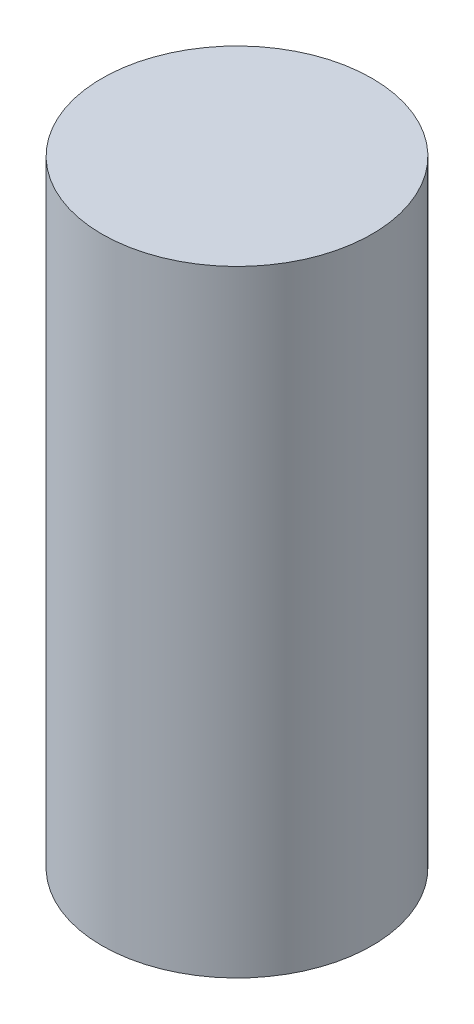
ISO-10303-21;
HEADER;
FILE_DESCRIPTION(('STEP AP214'),'2;1');
FILE_NAME('part.step','',(''),(''),'','','');
FILE_SCHEMA(('AUTOMOTIVE_DESIGN { 1 0 10303 214 1 1 1 1 }'));
ENDSEC;
DATA;
#1=APPLICATION_CONTEXT('core data for automotive mechanical design processes');
#2=APPLICATION_PROTOCOL_DEFINITION('international standard','automotive_design',2000,#1);
#3=PRODUCT_CONTEXT('',#1,'mechanical');
#4=PRODUCT('Part','Part','',(#3));
#5=PRODUCT_RELATED_PRODUCT_CATEGORY('part','',(#4));
#6=PRODUCT_DEFINITION_FORMATION('','',#4);
#7=PRODUCT_DEFINITION_CONTEXT('part definition',#1,'design');
#8=PRODUCT_DEFINITION('design','',#6,#7);
#9=PRODUCT_DEFINITION_SHAPE('','',#8);
#10=(LENGTH_UNIT() NAMED_UNIT(*) SI_UNIT(.MILLI.,.METRE.));
#11=(NAMED_UNIT(*) PLANE_ANGLE_UNIT() SI_UNIT($,.RADIAN.));
#12=(NAMED_UNIT(*) SI_UNIT($,.STERADIAN.) SOLID_ANGLE_UNIT());
#13=UNCERTAINTY_MEASURE_WITH_UNIT(LENGTH_MEASURE(1.E-05),#10,'distance_accuracy_value','');
#14=(GEOMETRIC_REPRESENTATION_CONTEXT(3) GLOBAL_UNCERTAINTY_ASSIGNED_CONTEXT((#13)) GLOBAL_UNIT_ASSIGNED_CONTEXT((#10,
#11,#12)) REPRESENTATION_CONTEXT('',''));
#15=CARTESIAN_POINT('',(0.,0.,0.));
#16=DIRECTION('',(0.,0.,1.));
#17=DIRECTION('',(1.,0.,0.));
#18=AXIS2_PLACEMENT_3D('',#15,#16,#17);
#19=CARTESIAN_POINT('',(0.,62.,0.));
#20=DIRECTION('',(0.,-1.,0.));
#21=DIRECTION('',(0.,0.,-1.));
#22=AXIS2_PLACEMENT_3D('',#19,#20,#21);
#23=CYLINDRICAL_SURFACE('',#22,13.585);
#24=CARTESIAN_POINT('',(0.,62.,0.));
#25=DIRECTION('',(0.,1.,0.));
#26=DIRECTION('',(0.,0.,1.));
#27=AXIS2_PLACEMENT_3D('',#24,#25,#26);
#28=CIRCLE('',#27,13.585);
#29=CARTESIAN_POINT('',(0.,62.,13.585));
#30=VERTEX_POINT('',#29);
#31=EDGE_CURVE('E53',#30,#30,#28,.T.);
#32=ORIENTED_EDGE('',*,*,#31,.F.);
#33=EDGE_LOOP('',(#32));
#34=FACE_BOUND('',#33,.T.);
#35=CARTESIAN_POINT('',(0.,0.,0.));
#36=DIRECTION('',(0.,1.,0.));
#37=DIRECTION('',(0.,0.,1.));
#38=AXIS2_PLACEMENT_3D('',#35,#36,#37);
#39=CIRCLE('',#38,13.585);
#40=CARTESIAN_POINT('',(0.,0.,13.585));
#41=VERTEX_POINT('',#40);
#42=EDGE_CURVE('E58',#41,#41,#39,.T.);
#43=ORIENTED_EDGE('',*,*,#42,.T.);
#44=EDGE_LOOP('',(#43));
#45=FACE_BOUND('',#44,.T.);
#46=ADVANCED_FACE('F41',(#34,#45),#23,.T.);
#47=CARTESIAN_POINT('',(0.,62.,0.));
#48=DIRECTION('',(0.,1.,0.));
#49=DIRECTION('',(0.,0.,1.));
#50=AXIS2_PLACEMENT_3D('',#47,#48,#49);
#51=PLANE('',#50);
#52=ORIENTED_EDGE('',*,*,#31,.T.);
#53=EDGE_LOOP('',(#52));
#54=FACE_BOUND('',#53,.T.);
#55=ADVANCED_FACE('F103',(#54),#51,.T.);
#56=CARTESIAN_POINT('',(0.,0.,0.));
#57=DIRECTION('',(0.,1.,0.));
#58=DIRECTION('',(0.,0.,1.));
#59=AXIS2_PLACEMENT_3D('',#56,#57,#58);
#60=PLANE('',#59);
#61=CARTESIAN_POINT('',(0.,0.,0.));
#62=DIRECTION('',(0.,1.,0.));
#63=DIRECTION('',(0.,0.,1.));
#64=AXIS2_PLACEMENT_3D('',#61,#62,#63);
#65=CIRCLE('',#64,3.33901321520406);
#66=CARTESIAN_POINT('',(0.,0.,3.33901321520406));
#67=VERTEX_POINT('',#66);
#68=EDGE_CURVE('E48',#67,#67,#65,.F.);
#69=ORIENTED_EDGE('',*,*,#68,.F.);
#70=EDGE_LOOP('',(#69));
#71=FACE_BOUND('',#70,.T.);
#72=ORIENTED_EDGE('',*,*,#42,.F.);
#73=EDGE_LOOP('',(#72));
#74=FACE_BOUND('',#73,.T.);
#75=ADVANCED_FACE('F94',(#71,#74),#60,.F.);
#76=CARTESIAN_POINT('',(0.,0.,0.));
#77=DIRECTION('',(0.,1.,0.));
#78=DIRECTION('',(0.,0.,1.));
#79=AXIS2_PLACEMENT_3D('',#76,#77,#78);
#80=CYLINDRICAL_SURFACE('',#79,2.33901321520406);
#81=CARTESIAN_POINT('',(0.,-6.,0.));
#82=DIRECTION('',(0.,1.,0.));
#83=DIRECTION('',(0.,0.,1.));
#84=AXIS2_PLACEMENT_3D('',#81,#82,#83);
#85=CIRCLE('',#84,2.33901321520406);
#86=CARTESIAN_POINT('',(0.,-6.,2.33901321520406));
#87=VERTEX_POINT('',#86);
#88=EDGE_CURVE('E84',#87,#87,#85,.T.);
#89=ORIENTED_EDGE('',*,*,#88,.F.);
#90=EDGE_LOOP('',(#89));
#91=FACE_BOUND('',#90,.T.);
#92=CARTESIAN_POINT('',(0.,0.,0.));
#93=DIRECTION('',(0.,1.,0.));
#94=DIRECTION('',(0.,0.,1.));
#95=AXIS2_PLACEMENT_3D('',#92,#93,#94);
#96=CIRCLE('',#95,2.33901321520406);
#97=CARTESIAN_POINT('',(0.,0.,2.33901321520406));
#98=VERTEX_POINT('',#97);
#99=EDGE_CURVE('E10',#98,#98,#96,.T.);
#100=ORIENTED_EDGE('',*,*,#99,.T.);
#101=EDGE_LOOP('',(#100));
#102=FACE_BOUND('',#101,.T.);
#103=ADVANCED_FACE('F91',(#91,#102),#80,.F.);
#104=CARTESIAN_POINT('',(0.,-2.,0.));
#105=DIRECTION('',(0.,1.,0.));
#106=DIRECTION('',(0.,0.,1.));
#107=AXIS2_PLACEMENT_3D('',#104,#105,#106);
#108=CONICAL_SURFACE('',#107,2.73901321520406,0.291456794477867);
#109=ORIENTED_EDGE('',*,*,#68,.T.);
#110=EDGE_LOOP('',(#109));
#111=FACE_BOUND('',#110,.T.);
#112=CARTESIAN_POINT('',(0.,-2.,0.));
#113=DIRECTION('',(0.,1.,0.));
#114=DIRECTION('',(0.,0.,1.));
#115=AXIS2_PLACEMENT_3D('',#112,#113,#114);
#116=CIRCLE('',#115,2.73901321520406);
#117=CARTESIAN_POINT('',(0.,-2.,2.73901321520406));
#118=VERTEX_POINT('',#117);
#119=EDGE_CURVE('E63',#118,#118,#116,.T.);
#120=ORIENTED_EDGE('',*,*,#119,.T.);
#121=EDGE_LOOP('',(#120));
#122=FACE_BOUND('',#121,.T.);
#123=ADVANCED_FACE('F93',(#111,#122),#108,.T.);
#124=CARTESIAN_POINT('',(2.73901321520406,-2.,0.));
#125=DIRECTION('',(0.,-1.,0.));
#126=DIRECTION('',(0.,0.,-1.));
#127=AXIS2_PLACEMENT_3D('',#124,#125,#126);
#128=PLANE('',#127);
#129=ORIENTED_EDGE('',*,*,#119,.F.);
#130=EDGE_LOOP('',(#129));
#131=FACE_BOUND('',#130,.T.);
#132=CARTESIAN_POINT('',(0.,-2.,0.));
#133=DIRECTION('',(0.,1.,0.));
#134=DIRECTION('',(0.,0.,1.));
#135=AXIS2_PLACEMENT_3D('',#132,#133,#134);
#136=CIRCLE('',#135,3.33901321520406);
#137=CARTESIAN_POINT('',(0.,-2.,3.33901321520406));
#138=VERTEX_POINT('',#137);
#139=EDGE_CURVE('E68',#138,#138,#136,.T.);
#140=ORIENTED_EDGE('',*,*,#139,.T.);
#141=EDGE_LOOP('',(#140));
#142=FACE_BOUND('',#141,.T.);
#143=ADVANCED_FACE('F100',(#131,#142),#128,.F.);
#144=CARTESIAN_POINT('',(0.,-4.,0.));
#145=DIRECTION('',(0.,1.,0.));
#146=DIRECTION('',(0.,0.,1.));
#147=AXIS2_PLACEMENT_3D('',#144,#145,#146);
#148=CONICAL_SURFACE('',#147,2.73901321520406,0.291456794477867);
#149=ORIENTED_EDGE('',*,*,#139,.F.);
#150=EDGE_LOOP('',(#149));
#151=FACE_BOUND('',#150,.T.);
#152=CARTESIAN_POINT('',(0.,-4.,0.));
#153=DIRECTION('',(0.,1.,0.));
#154=DIRECTION('',(0.,0.,1.));
#155=AXIS2_PLACEMENT_3D('',#152,#153,#154);
#156=CIRCLE('',#155,2.73901321520406);
#157=CARTESIAN_POINT('',(0.,-4.,2.73901321520406));
#158=VERTEX_POINT('',#157);
#159=EDGE_CURVE('E72',#158,#158,#156,.T.);
#160=ORIENTED_EDGE('',*,*,#159,.T.);
#161=EDGE_LOOP('',(#160));
#162=FACE_BOUND('',#161,.T.);
#163=ADVANCED_FACE('F156',(#151,#162),#148,.T.);
#164=CARTESIAN_POINT('',(2.73901321520406,-4.,0.));
#165=DIRECTION('',(0.,-1.,0.));
#166=DIRECTION('',(0.,0.,-1.));
#167=AXIS2_PLACEMENT_3D('',#164,#165,#166);
#168=PLANE('',#167);
#169=ORIENTED_EDGE('',*,*,#159,.F.);
#170=EDGE_LOOP('',(#169));
#171=FACE_BOUND('',#170,.T.);
#172=CARTESIAN_POINT('',(0.,-4.,0.));
#173=DIRECTION('',(0.,1.,0.));
#174=DIRECTION('',(0.,0.,1.));
#175=AXIS2_PLACEMENT_3D('',#172,#173,#174);
#176=CIRCLE('',#175,3.33901321520406);
#177=CARTESIAN_POINT('',(0.,-4.,3.33901321520406));
#178=VERTEX_POINT('',#177);
#179=EDGE_CURVE('E76',#178,#178,#176,.T.);
#180=ORIENTED_EDGE('',*,*,#179,.T.);
#181=EDGE_LOOP('',(#180));
#182=FACE_BOUND('',#181,.T.);
#183=ADVANCED_FACE('F167',(#171,#182),#168,.F.);
#184=CARTESIAN_POINT('',(0.,-6.,0.));
#185=DIRECTION('',(0.,1.,0.));
#186=DIRECTION('',(0.,0.,1.));
#187=AXIS2_PLACEMENT_3D('',#184,#185,#186);
#188=CONICAL_SURFACE('',#187,2.73901321520406,0.291456794477867);
#189=ORIENTED_EDGE('',*,*,#179,.F.);
#190=EDGE_LOOP('',(#189));
#191=FACE_BOUND('',#190,.T.);
#192=CARTESIAN_POINT('',(0.,-6.,0.));
#193=DIRECTION('',(0.,1.,0.));
#194=DIRECTION('',(0.,0.,1.));
#195=AXIS2_PLACEMENT_3D('',#192,#193,#194);
#196=CIRCLE('',#195,2.73901321520406);
#197=CARTESIAN_POINT('',(0.,-6.,2.73901321520406));
#198=VERTEX_POINT('',#197);
#199=EDGE_CURVE('E80',#198,#198,#196,.T.);
#200=ORIENTED_EDGE('',*,*,#199,.T.);
#201=EDGE_LOOP('',(#200));
#202=FACE_BOUND('',#201,.T.);
#203=ADVANCED_FACE('F178',(#191,#202),#188,.T.);
#204=CARTESIAN_POINT('',(2.33901321520406,-6.,0.));
#205=DIRECTION('',(0.,1.,0.));
#206=DIRECTION('',(0.,0.,1.));
#207=AXIS2_PLACEMENT_3D('',#204,#205,#206);
#208=PLANE('',#207);
#209=ORIENTED_EDGE('',*,*,#199,.F.);
#210=EDGE_LOOP('',(#209));
#211=FACE_BOUND('',#210,.T.);
#212=ORIENTED_EDGE('',*,*,#88,.T.);
#213=EDGE_LOOP('',(#212));
#214=FACE_BOUND('',#213,.T.);
#215=ADVANCED_FACE('F89',(#211,#214),#208,.F.);
#216=ORIENTED_EDGE('',*,*,#99,.F.);
#217=EDGE_LOOP('',(#216));
#218=FACE_BOUND('',#217,.T.);
#219=ADVANCED_FACE('F105',(#218),#60,.F.);
#220=CLOSED_SHELL('',(#46,#55,#75,#103,#123,#143,#163,#183,#203,#215,#219));
#221=MANIFOLD_SOLID_BREP('B2',#220);
#222=ADVANCED_BREP_SHAPE_REPRESENTATION('',(#18,#221),#14);
#223=SHAPE_DEFINITION_REPRESENTATION(#9,#222);
ENDSEC;
END-ISO-10303-21;
